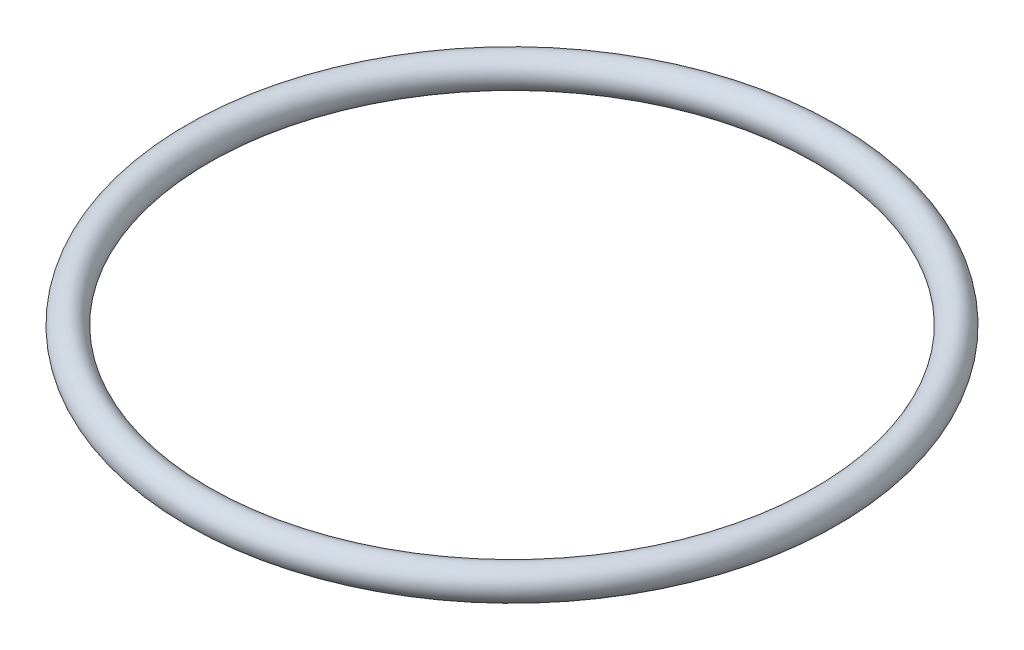
ISO-10303-21;
HEADER;
FILE_DESCRIPTION(('STEP AP214'),'2;1');
FILE_NAME('part.step','',(''),(''),'','','');
FILE_SCHEMA(('AUTOMOTIVE_DESIGN { 1 0 10303 214 1 1 1 1 }'));
ENDSEC;
DATA;
#1=APPLICATION_CONTEXT('core data for automotive mechanical design processes');
#2=APPLICATION_PROTOCOL_DEFINITION('international standard','automotive_design',2000,#1);
#3=PRODUCT_CONTEXT('',#1,'mechanical');
#4=PRODUCT('Part','Part','',(#3));
#5=PRODUCT_RELATED_PRODUCT_CATEGORY('part','',(#4));
#6=PRODUCT_DEFINITION_FORMATION('','',#4);
#7=PRODUCT_DEFINITION_CONTEXT('part definition',#1,'design');
#8=PRODUCT_DEFINITION('design','',#6,#7);
#9=PRODUCT_DEFINITION_SHAPE('','',#8);
#10=(LENGTH_UNIT() NAMED_UNIT(*) SI_UNIT(.MILLI.,.METRE.));
#11=(NAMED_UNIT(*) PLANE_ANGLE_UNIT() SI_UNIT($,.RADIAN.));
#12=(NAMED_UNIT(*) SI_UNIT($,.STERADIAN.) SOLID_ANGLE_UNIT());
#13=UNCERTAINTY_MEASURE_WITH_UNIT(LENGTH_MEASURE(1.E-05),#10,'distance_accuracy_value','');
#14=(GEOMETRIC_REPRESENTATION_CONTEXT(3) GLOBAL_UNCERTAINTY_ASSIGNED_CONTEXT((#13)) GLOBAL_UNIT_ASSIGNED_CONTEXT((#10,
#11,#12)) REPRESENTATION_CONTEXT('',''));
#15=CARTESIAN_POINT('',(0.,0.,0.));
#16=DIRECTION('',(0.,0.,1.));
#17=DIRECTION('',(1.,0.,0.));
#18=AXIS2_PLACEMENT_3D('',#15,#16,#17);
#19=CARTESIAN_POINT('',(0.,0.,0.));
#20=DIRECTION('',(0.,-1.,0.));
#21=DIRECTION('',(0.,0.,-1.));
#22=AXIS2_PLACEMENT_3D('',#19,#20,#21);
#23=TOROIDAL_SURFACE('',#22,26.543,1.3081);
#24=CARTESIAN_POINT('',(0.,0.,-27.8511));
#25=VERTEX_POINT('',#24);
#26=VERTEX_LOOP('',#25);
#27=FACE_BOUND('',#26,.T.);
#28=ADVANCED_FACE('F28',(#27),#23,.T.);
#29=CLOSED_SHELL('',(#28));
#30=MANIFOLD_SOLID_BREP('B2',#29);
#31=ADVANCED_BREP_SHAPE_REPRESENTATION('',(#18,#30),#14);
#32=SHAPE_DEFINITION_REPRESENTATION(#9,#31);
ENDSEC;
END-ISO-10303-21;
